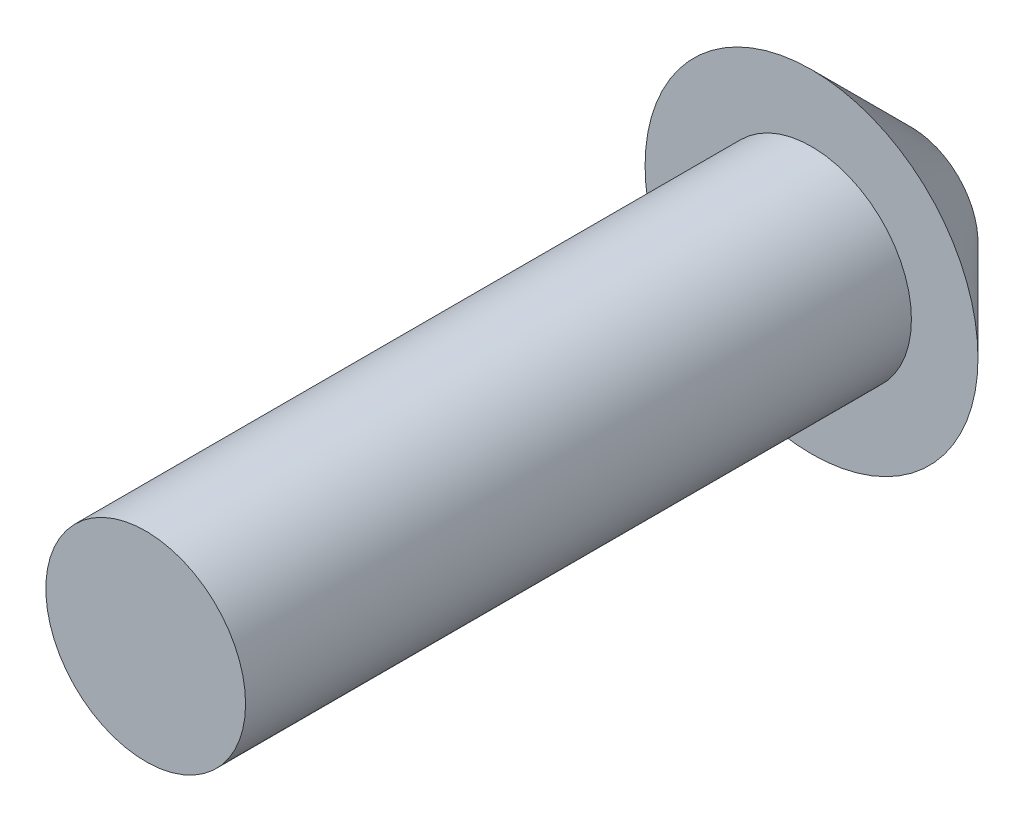
ISO-10303-21;
HEADER;
FILE_DESCRIPTION(('STEP AP214'),'2;1');
FILE_NAME('part.step','',(''),(''),'','','');
FILE_SCHEMA(('AUTOMOTIVE_DESIGN { 1 0 10303 214 1 1 1 1 }'));
ENDSEC;
DATA;
#1=APPLICATION_CONTEXT('core data for automotive mechanical design processes');
#2=APPLICATION_PROTOCOL_DEFINITION('international standard','automotive_design',2000,#1);
#3=PRODUCT_CONTEXT('',#1,'mechanical');
#4=PRODUCT('Part','Part','',(#3));
#5=PRODUCT_RELATED_PRODUCT_CATEGORY('part','',(#4));
#6=PRODUCT_DEFINITION_FORMATION('','',#4);
#7=PRODUCT_DEFINITION_CONTEXT('part definition',#1,'design');
#8=PRODUCT_DEFINITION('design','',#6,#7);
#9=PRODUCT_DEFINITION_SHAPE('','',#8);
#10=(LENGTH_UNIT() NAMED_UNIT(*) SI_UNIT(.MILLI.,.METRE.));
#11=(NAMED_UNIT(*) PLANE_ANGLE_UNIT() SI_UNIT($,.RADIAN.));
#12=(NAMED_UNIT(*) SI_UNIT($,.STERADIAN.) SOLID_ANGLE_UNIT());
#13=UNCERTAINTY_MEASURE_WITH_UNIT(LENGTH_MEASURE(1.E-05),#10,'distance_accuracy_value','');
#14=(GEOMETRIC_REPRESENTATION_CONTEXT(3) GLOBAL_UNCERTAINTY_ASSIGNED_CONTEXT((#13)) GLOBAL_UNIT_ASSIGNED_CONTEXT((#10,
#11,#12)) REPRESENTATION_CONTEXT('',''));
#15=CARTESIAN_POINT('',(0.,0.,0.));
#16=DIRECTION('',(0.,0.,1.));
#17=DIRECTION('',(1.,0.,0.));
#18=AXIS2_PLACEMENT_3D('',#15,#16,#17);
#19=CARTESIAN_POINT('',(0.,0.,-114.75));
#20=DIRECTION('',(0.,0.,1.));
#21=DIRECTION('',(1.,0.,0.));
#22=AXIS2_PLACEMENT_3D('',#19,#20,#21);
#23=PLANE('',#22);
#24=CARTESIAN_POINT('',(0.,0.,-114.75));
#25=DIRECTION('',(0.,0.,1.));
#26=DIRECTION('',(1.,0.,0.));
#27=AXIS2_PLACEMENT_3D('',#24,#25,#26);
#28=CIRCLE('',#27,1.5);
#29=CARTESIAN_POINT('',(1.5,0.,-114.75));
#30=VERTEX_POINT('',#29);
#31=EDGE_CURVE('E10',#30,#30,#28,.T.);
#32=ORIENTED_EDGE('',*,*,#31,.F.);
#33=EDGE_LOOP('',(#32));
#34=FACE_BOUND('',#33,.T.);
#35=CARTESIAN_POINT('',(0.,0.,-114.75));
#36=DIRECTION('',(0.,0.,-1.));
#37=DIRECTION('',(-1.,0.,0.));
#38=AXIS2_PLACEMENT_3D('',#35,#36,#37);
#39=CIRCLE('',#38,2.50000000000002);
#40=CARTESIAN_POINT('',(-2.50000000000002,0.,-114.75));
#41=VERTEX_POINT('',#40);
#42=EDGE_CURVE('E50',#41,#41,#39,.T.);
#43=ORIENTED_EDGE('',*,*,#42,.F.);
#44=EDGE_LOOP('',(#43));
#45=FACE_BOUND('',#44,.T.);
#46=ADVANCED_FACE('F39',(#34,#45),#23,.T.);
#47=CARTESIAN_POINT('',(0.,0.,-114.75));
#48=DIRECTION('',(0.,0.,1.));
#49=DIRECTION('',(1.,0.,0.));
#50=AXIS2_PLACEMENT_3D('',#47,#48,#49);
#51=CONICAL_SURFACE('',#50,2.50000000000002,0.785398163397443);
#52=CARTESIAN_POINT('',(0.,0.,-116.25));
#53=DIRECTION('',(0.,0.,-1.));
#54=DIRECTION('',(-1.,0.,0.));
#55=AXIS2_PLACEMENT_3D('',#52,#53,#54);
#56=CIRCLE('',#55,1.00000000000003);
#57=CARTESIAN_POINT('',(-1.00000000000003,0.,-116.25));
#58=VERTEX_POINT('',#57);
#59=EDGE_CURVE('E42',#58,#58,#56,.T.);
#60=ORIENTED_EDGE('',*,*,#59,.F.);
#61=EDGE_LOOP('',(#60));
#62=FACE_BOUND('',#61,.T.);
#63=ORIENTED_EDGE('',*,*,#42,.T.);
#64=EDGE_LOOP('',(#63));
#65=FACE_BOUND('',#64,.T.);
#66=ADVANCED_FACE('F62',(#62,#65),#51,.T.);
#67=CARTESIAN_POINT('',(0.,0.,-116.25));
#68=DIRECTION('',(0.,0.,1.));
#69=DIRECTION('',(1.,0.,0.));
#70=AXIS2_PLACEMENT_3D('',#67,#68,#69);
#71=PLANE('',#70);
#72=CARTESIAN_POINT('',(0.,0.500000000000015,-116.25));
#73=DIRECTION('',(0.,0.,-1.));
#74=DIRECTION('',(-1.,0.,0.));
#75=AXIS2_PLACEMENT_3D('',#72,#73,#74);
#76=CIRCLE('',#75,0.25);
#77=CARTESIAN_POINT('',(-0.25,0.500000000000015,-116.25));
#78=VERTEX_POINT('',#77);
#79=EDGE_CURVE('E57',#78,#78,#76,.T.);
#80=ORIENTED_EDGE('',*,*,#79,.F.);
#81=EDGE_LOOP('',(#80));
#82=FACE_BOUND('',#81,.T.);
#83=ORIENTED_EDGE('',*,*,#59,.T.);
#84=EDGE_LOOP('',(#83));
#85=FACE_BOUND('',#84,.T.);
#86=ADVANCED_FACE('F71',(#82,#85),#71,.F.);
#87=CARTESIAN_POINT('',(0.,0.500000000000015,-115.25));
#88=DIRECTION('',(0.,0.,-1.));
#89=DIRECTION('',(-1.,0.,0.));
#90=AXIS2_PLACEMENT_3D('',#87,#88,#89);
#91=CYLINDRICAL_SURFACE('',#90,0.25);
#92=CARTESIAN_POINT('',(0.,0.500000000000015,-115.25));
#93=DIRECTION('',(0.,0.,-1.));
#94=DIRECTION('',(-1.,0.,0.));
#95=AXIS2_PLACEMENT_3D('',#92,#93,#94);
#96=CIRCLE('',#95,0.25);
#97=CARTESIAN_POINT('',(-0.25,0.500000000000015,-115.25));
#98=VERTEX_POINT('',#97);
#99=EDGE_CURVE('E54',#98,#98,#96,.T.);
#100=ORIENTED_EDGE('',*,*,#99,.F.);
#101=EDGE_LOOP('',(#100));
#102=FACE_BOUND('',#101,.T.);
#103=ORIENTED_EDGE('',*,*,#79,.T.);
#104=EDGE_LOOP('',(#103));
#105=FACE_BOUND('',#104,.T.);
#106=ADVANCED_FACE('F77',(#102,#105),#91,.F.);
#107=CARTESIAN_POINT('',(0.,0.500000000000015,-115.25));
#108=DIRECTION('',(0.,0.,-1.));
#109=DIRECTION('',(-1.,0.,0.));
#110=AXIS2_PLACEMENT_3D('',#107,#108,#109);
#111=PLANE('',#110);
#112=ORIENTED_EDGE('',*,*,#99,.T.);
#113=EDGE_LOOP('',(#112));
#114=FACE_BOUND('',#113,.T.);
#115=ADVANCED_FACE('F83',(#114),#111,.T.);
#116=CARTESIAN_POINT('',(0.,0.,-104.75));
#117=DIRECTION('',(0.,0.,-1.));
#118=DIRECTION('',(-1.,0.,0.));
#119=AXIS2_PLACEMENT_3D('',#116,#117,#118);
#120=CYLINDRICAL_SURFACE('',#119,1.5);
#121=CARTESIAN_POINT('',(0.,0.,-104.75));
#122=DIRECTION('',(0.,0.,1.));
#123=DIRECTION('',(1.,0.,0.));
#124=AXIS2_PLACEMENT_3D('',#121,#122,#123);
#125=CIRCLE('',#124,1.5);
#126=CARTESIAN_POINT('',(1.5,0.,-104.75));
#127=VERTEX_POINT('',#126);
#128=EDGE_CURVE('E53',#127,#127,#125,.T.);
#129=ORIENTED_EDGE('',*,*,#128,.F.);
#130=EDGE_LOOP('',(#129));
#131=FACE_BOUND('',#130,.T.);
#132=ORIENTED_EDGE('',*,*,#31,.T.);
#133=EDGE_LOOP('',(#132));
#134=FACE_BOUND('',#133,.T.);
#135=ADVANCED_FACE('F86',(#131,#134),#120,.T.);
#136=CARTESIAN_POINT('',(0.,0.,-104.75));
#137=DIRECTION('',(0.,0.,1.));
#138=DIRECTION('',(1.,0.,0.));
#139=AXIS2_PLACEMENT_3D('',#136,#137,#138);
#140=PLANE('',#139);
#141=ORIENTED_EDGE('',*,*,#128,.T.);
#142=EDGE_LOOP('',(#141));
#143=FACE_BOUND('',#142,.T.);
#144=ADVANCED_FACE('F89',(#143),#140,.T.);
#145=CLOSED_SHELL('',(#46,#66,#86,#106,#115,#135,#144));
#146=MANIFOLD_SOLID_BREP('B2',#145);
#147=ADVANCED_BREP_SHAPE_REPRESENTATION('',(#18,#146),#14);
#148=SHAPE_DEFINITION_REPRESENTATION(#9,#147);
ENDSEC;
END-ISO-10303-21;
